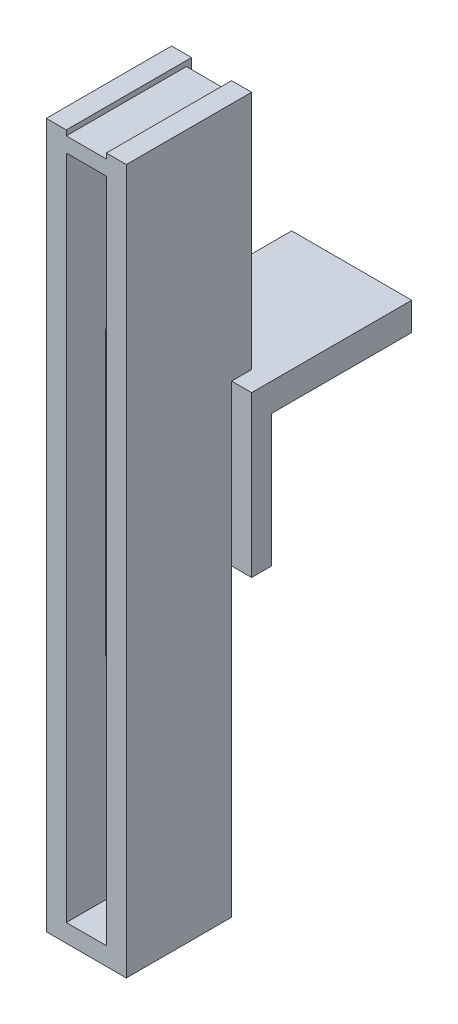
ISO-10303-21;
HEADER;
FILE_DESCRIPTION(('STEP AP214'),'2;1');
FILE_NAME('part.step','',(''),(''),'','','');
FILE_SCHEMA(('AUTOMOTIVE_DESIGN { 1 0 10303 214 1 1 1 1 }'));
ENDSEC;
DATA;
#1=APPLICATION_CONTEXT('core data for automotive mechanical design processes');
#2=APPLICATION_PROTOCOL_DEFINITION('international standard','automotive_design',2000,#1);
#3=PRODUCT_CONTEXT('',#1,'mechanical');
#4=PRODUCT('Part','Part','',(#3));
#5=PRODUCT_RELATED_PRODUCT_CATEGORY('part','',(#4));
#6=PRODUCT_DEFINITION_FORMATION('','',#4);
#7=PRODUCT_DEFINITION_CONTEXT('part definition',#1,'design');
#8=PRODUCT_DEFINITION('design','',#6,#7);
#9=PRODUCT_DEFINITION_SHAPE('','',#8);
#10=(LENGTH_UNIT() NAMED_UNIT(*) SI_UNIT(.MILLI.,.METRE.));
#11=(NAMED_UNIT(*) PLANE_ANGLE_UNIT() SI_UNIT($,.RADIAN.));
#12=(NAMED_UNIT(*) SI_UNIT($,.STERADIAN.) SOLID_ANGLE_UNIT());
#13=UNCERTAINTY_MEASURE_WITH_UNIT(LENGTH_MEASURE(1.E-05),#10,'distance_accuracy_value','');
#14=(GEOMETRIC_REPRESENTATION_CONTEXT(3) GLOBAL_UNCERTAINTY_ASSIGNED_CONTEXT((#13)) GLOBAL_UNIT_ASSIGNED_CONTEXT((#10,
#11,#12)) REPRESENTATION_CONTEXT('',''));
#15=CARTESIAN_POINT('',(0.,0.,0.));
#16=DIRECTION('',(0.,0.,1.));
#17=DIRECTION('',(1.,0.,0.));
#18=AXIS2_PLACEMENT_3D('',#15,#16,#17);
#19=CARTESIAN_POINT('',(-5.,0.,0.));
#20=DIRECTION('',(1.,0.,0.));
#21=DIRECTION('',(0.,0.,-1.));
#22=AXIS2_PLACEMENT_3D('',#19,#20,#21);
#23=PLANE('',#22);
#24=DIRECTION('',(0.,-1.,0.));
#25=VECTOR('',#24,1.);
#26=CARTESIAN_POINT('',(-5.,60.,26.3));
#27=LINE('',#26,#25);
#28=CARTESIAN_POINT('',(-5.,55.,26.3));
#29=VERTEX_POINT('',#28);
#30=CARTESIAN_POINT('',(-5.,-111.5,26.3));
#31=VERTEX_POINT('',#30);
#32=EDGE_CURVE('E262',#29,#31,#27,.T.);
#33=ORIENTED_EDGE('',*,*,#32,.T.);
#34=DIRECTION('',(0.,0.,-1.));
#35=VECTOR('',#34,1.);
#36=CARTESIAN_POINT('',(-5.,-111.5,26.3));
#37=LINE('',#36,#35);
#38=CARTESIAN_POINT('',(-5.,-111.5,8.50000000000001));
#39=VERTEX_POINT('',#38);
#40=EDGE_CURVE('E228',#31,#39,#37,.T.);
#41=ORIENTED_EDGE('',*,*,#40,.T.);
#42=DIRECTION('',(0.,-1.,0.));
#43=VECTOR('',#42,1.);
#44=CARTESIAN_POINT('',(-5.,-71.6268822125199,8.5));
#45=LINE('',#44,#43);
#46=CARTESIAN_POINT('',(-5.,-71.6268822125199,8.5));
#47=VERTEX_POINT('',#46);
#48=EDGE_CURVE('E313',#47,#39,#45,.T.);
#49=ORIENTED_EDGE('',*,*,#48,.F.);
#50=DIRECTION('',(0.,-0.850975633269342,-0.525205170939741));
#51=VECTOR('',#50,1.);
#52=CARTESIAN_POINT('',(-5.,-58.6123165611938,16.5323300813571));
#53=LINE('',#52,#51);
#54=CARTESIAN_POINT('',(-5.,-58.6123165611938,16.5323300813571));
#55=VERTEX_POINT('',#54);
#56=EDGE_CURVE('E325',#55,#47,#53,.T.);
#57=ORIENTED_EDGE('',*,*,#56,.F.);
#58=DIRECTION('',(0.,-1.,0.));
#59=VECTOR('',#58,1.);
#60=CARTESIAN_POINT('',(-5.,11.8291720369188,16.5323300813571));
#61=LINE('',#60,#59);
#62=CARTESIAN_POINT('',(-5.,11.8291720369188,16.5323300813571));
#63=VERTEX_POINT('',#62);
#64=EDGE_CURVE('E322',#63,#55,#61,.T.);
#65=ORIENTED_EDGE('',*,*,#64,.F.);
#66=DIRECTION('',(0.,-0.866025403784442,0.499999999999995));
#67=VECTOR('',#66,1.);
#68=CARTESIAN_POINT('',(-5.,40.464007705329,0.));
#69=LINE('',#68,#67);
#70=CARTESIAN_POINT('',(-5.,40.464007705329,0.));
#71=VERTEX_POINT('',#70);
#72=EDGE_CURVE('E301',#71,#63,#69,.T.);
#73=ORIENTED_EDGE('',*,*,#72,.F.);
#74=DIRECTION('',(0.,1.,0.));
#75=VECTOR('',#74,1.);
#76=CARTESIAN_POINT('',(-5.,0.,0.));
#77=LINE('',#76,#75);
#78=CARTESIAN_POINT('',(-5.,55.,0.));
#79=VERTEX_POINT('',#78);
#80=EDGE_CURVE('E448',#71,#79,#77,.T.);
#81=ORIENTED_EDGE('',*,*,#80,.T.);
#82=DIRECTION('',(0.,0.,1.));
#83=VECTOR('',#82,1.);
#84=CARTESIAN_POINT('',(-5.,55.,0.));
#85=LINE('',#84,#83);
#86=EDGE_CURVE('E459',#79,#29,#85,.T.);
#87=ORIENTED_EDGE('',*,*,#86,.T.);
#88=EDGE_LOOP('',(#33,#41,#49,#57,#65,#73,#81,#87));
#89=FACE_BOUND('',#88,.T.);
#90=ADVANCED_FACE('F43',(#89),#23,.T.);
#91=CARTESIAN_POINT('',(5.,0.,0.));
#92=DIRECTION('',(-1.,0.,0.));
#93=DIRECTION('',(0.,0.,-1.));
#94=AXIS2_PLACEMENT_3D('',#91,#92,#93);
#95=PLANE('',#94);
#96=DIRECTION('',(0.,-1.,0.));
#97=VECTOR('',#96,1.);
#98=CARTESIAN_POINT('',(5.,-71.6268822125199,8.5));
#99=LINE('',#98,#97);
#100=CARTESIAN_POINT('',(5.,-71.6268822125199,8.5));
#101=VERTEX_POINT('',#100);
#102=CARTESIAN_POINT('',(5.,-111.5,8.50000000000001));
#103=VERTEX_POINT('',#102);
#104=EDGE_CURVE('E240',#101,#103,#99,.T.);
#105=ORIENTED_EDGE('',*,*,#104,.T.);
#106=DIRECTION('',(0.,0.,-1.));
#107=VECTOR('',#106,1.);
#108=CARTESIAN_POINT('',(5.,-111.5,26.3));
#109=LINE('',#108,#107);
#110=CARTESIAN_POINT('',(5.,-111.5,26.3));
#111=VERTEX_POINT('',#110);
#112=EDGE_CURVE('E225',#111,#103,#109,.T.);
#113=ORIENTED_EDGE('',*,*,#112,.F.);
#114=DIRECTION('',(0.,-1.,0.));
#115=VECTOR('',#114,1.);
#116=CARTESIAN_POINT('',(5.,60.,26.3));
#117=LINE('',#116,#115);
#118=CARTESIAN_POINT('',(5.,55.,26.3));
#119=VERTEX_POINT('',#118);
#120=EDGE_CURVE('E237',#119,#111,#117,.T.);
#121=ORIENTED_EDGE('',*,*,#120,.F.);
#122=DIRECTION('',(0.,0.,1.));
#123=VECTOR('',#122,1.);
#124=CARTESIAN_POINT('',(5.,55.,0.));
#125=LINE('',#124,#123);
#126=CARTESIAN_POINT('',(5.,55.,0.));
#127=VERTEX_POINT('',#126);
#128=EDGE_CURVE('E451',#127,#119,#125,.T.);
#129=ORIENTED_EDGE('',*,*,#128,.F.);
#130=DIRECTION('',(0.,1.,0.));
#131=VECTOR('',#130,1.);
#132=CARTESIAN_POINT('',(5.,0.,0.));
#133=LINE('',#132,#131);
#134=CARTESIAN_POINT('',(5.,40.464007705329,0.));
#135=VERTEX_POINT('',#134);
#136=EDGE_CURVE('E241',#135,#127,#133,.T.);
#137=ORIENTED_EDGE('',*,*,#136,.F.);
#138=DIRECTION('',(0.,-0.866025403784442,0.499999999999995));
#139=VECTOR('',#138,1.);
#140=CARTESIAN_POINT('',(5.,40.464007705329,0.));
#141=LINE('',#140,#139);
#142=CARTESIAN_POINT('',(5.,11.8291720369188,16.5323300813571));
#143=VERTEX_POINT('',#142);
#144=EDGE_CURVE('E309',#135,#143,#141,.T.);
#145=ORIENTED_EDGE('',*,*,#144,.T.);
#146=DIRECTION('',(0.,-1.,0.));
#147=VECTOR('',#146,1.);
#148=CARTESIAN_POINT('',(5.,11.8291720369188,16.5323300813571));
#149=LINE('',#148,#147);
#150=CARTESIAN_POINT('',(5.,-58.6123165611938,16.5323300813571));
#151=VERTEX_POINT('',#150);
#152=EDGE_CURVE('E312',#143,#151,#149,.T.);
#153=ORIENTED_EDGE('',*,*,#152,.T.);
#154=DIRECTION('',(0.,-0.850975633269342,-0.525205170939741));
#155=VECTOR('',#154,1.);
#156=CARTESIAN_POINT('',(5.,-58.6123165611938,16.5323300813571));
#157=LINE('',#156,#155);
#158=EDGE_CURVE('E316',#151,#101,#157,.T.);
#159=ORIENTED_EDGE('',*,*,#158,.T.);
#160=EDGE_LOOP('',(#105,#113,#121,#129,#137,#145,#153,#159));
#161=FACE_BOUND('',#160,.T.);
#162=ADVANCED_FACE('F235',(#161),#95,.T.);
#163=CARTESIAN_POINT('',(5.,-71.6268822125199,8.5));
#164=DIRECTION('',(0.,0.,-1.));
#165=DIRECTION('',(0.,1.,0.));
#166=AXIS2_PLACEMENT_3D('',#163,#164,#165);
#167=PLANE('',#166);
#168=DIRECTION('',(-1.,0.,0.));
#169=VECTOR('',#168,1.);
#170=CARTESIAN_POINT('',(-5.,-111.5,8.50000000000001));
#171=LINE('',#170,#169);
#172=EDGE_CURVE('E230',#103,#39,#171,.T.);
#173=ORIENTED_EDGE('',*,*,#172,.F.);
#174=ORIENTED_EDGE('',*,*,#104,.F.);
#175=DIRECTION('',(-1.,0.,0.));
#176=VECTOR('',#175,1.);
#177=CARTESIAN_POINT('',(5.,-71.6268822125199,8.5));
#178=LINE('',#177,#176);
#179=EDGE_CURVE('E331',#101,#47,#178,.T.);
#180=ORIENTED_EDGE('',*,*,#179,.T.);
#181=ORIENTED_EDGE('',*,*,#48,.T.);
#182=EDGE_LOOP('',(#173,#174,#180,#181));
#183=FACE_BOUND('',#182,.T.);
#184=ADVANCED_FACE('F467',(#183),#167,.F.);
#185=CARTESIAN_POINT('',(15.,0.,-40.));
#186=DIRECTION('',(0.,-1.,0.));
#187=DIRECTION('',(0.,0.,-1.));
#188=AXIS2_PLACEMENT_3D('',#185,#186,#187);
#189=PLANE('',#188);
#190=DIRECTION('',(1.,0.,0.));
#191=VECTOR('',#190,1.);
#192=CARTESIAN_POINT('',(-5.,0.,-3.69999999999999));
#193=LINE('',#192,#191);
#194=CARTESIAN_POINT('',(-5.,0.,-3.69999999999999));
#195=VERTEX_POINT('',#194);
#196=CARTESIAN_POINT('',(5.,0.,-3.69999999999999));
#197=VERTEX_POINT('',#196);
#198=EDGE_CURVE('E442',#195,#197,#193,.T.);
#199=ORIENTED_EDGE('',*,*,#198,.T.);
#200=DIRECTION('',(0.,0.,-1.));
#201=VECTOR('',#200,1.);
#202=CARTESIAN_POINT('',(5.,0.,0.));
#203=LINE('',#202,#201);
#204=CARTESIAN_POINT('',(5.,0.,-5.));
#205=VERTEX_POINT('',#204);
#206=EDGE_CURVE('E258',#197,#205,#203,.T.);
#207=ORIENTED_EDGE('',*,*,#206,.T.);
#208=DIRECTION('',(-1.,0.,0.));
#209=VECTOR('',#208,1.);
#210=CARTESIAN_POINT('',(10.,0.,-5.));
#211=LINE('',#210,#209);
#212=CARTESIAN_POINT('',(10.,0.,-5.));
#213=VERTEX_POINT('',#212);
#214=EDGE_CURVE('E66',#213,#205,#211,.T.);
#215=ORIENTED_EDGE('',*,*,#214,.F.);
#216=DIRECTION('',(0.,0.,-1.));
#217=VECTOR('',#216,1.);
#218=CARTESIAN_POINT('',(10.,0.,0.));
#219=LINE('',#218,#217);
#220=CARTESIAN_POINT('',(10.,0.,0.));
#221=VERTEX_POINT('',#220);
#222=EDGE_CURVE('E426',#221,#213,#219,.T.);
#223=ORIENTED_EDGE('',*,*,#222,.F.);
#224=DIRECTION('',(-1.,0.,0.));
#225=VECTOR('',#224,1.);
#226=CARTESIAN_POINT('',(15.,0.,0.));
#227=LINE('',#226,#225);
#228=CARTESIAN_POINT('',(15.,0.,0.));
#229=VERTEX_POINT('',#228);
#230=EDGE_CURVE('E11',#229,#221,#227,.T.);
#231=ORIENTED_EDGE('',*,*,#230,.F.);
#232=DIRECTION('',(0.,0.,1.));
#233=VECTOR('',#232,1.);
#234=CARTESIAN_POINT('',(15.,0.,-40.));
#235=LINE('',#234,#233);
#236=CARTESIAN_POINT('',(15.,0.,-40.));
#237=VERTEX_POINT('',#236);
#238=EDGE_CURVE('E344',#237,#229,#235,.T.);
#239=ORIENTED_EDGE('',*,*,#238,.F.);
#240=DIRECTION('',(-1.,0.,0.));
#241=VECTOR('',#240,1.);
#242=CARTESIAN_POINT('',(15.,0.,-40.));
#243=LINE('',#242,#241);
#244=CARTESIAN_POINT('',(-15.,0.,-40.));
#245=VERTEX_POINT('',#244);
#246=EDGE_CURVE('E358',#237,#245,#243,.T.);
#247=ORIENTED_EDGE('',*,*,#246,.T.);
#248=DIRECTION('',(0.,0.,1.));
#249=VECTOR('',#248,1.);
#250=CARTESIAN_POINT('',(-15.,0.,-40.));
#251=LINE('',#250,#249);
#252=CARTESIAN_POINT('',(-15.,0.,0.));
#253=VERTEX_POINT('',#252);
#254=EDGE_CURVE('E343',#245,#253,#251,.T.);
#255=ORIENTED_EDGE('',*,*,#254,.T.);
#256=CARTESIAN_POINT('',(-10.,0.,0.));
#257=VERTEX_POINT('',#256);
#258=EDGE_CURVE('E51',#257,#253,#227,.T.);
#259=ORIENTED_EDGE('',*,*,#258,.F.);
#260=DIRECTION('',(0.,0.,-1.));
#261=VECTOR('',#260,1.);
#262=CARTESIAN_POINT('',(-10.,0.,0.));
#263=LINE('',#262,#261);
#264=CARTESIAN_POINT('',(-10.,0.,-5.));
#265=VERTEX_POINT('',#264);
#266=EDGE_CURVE('E280',#257,#265,#263,.T.);
#267=ORIENTED_EDGE('',*,*,#266,.T.);
#268=DIRECTION('',(1.,0.,0.));
#269=VECTOR('',#268,1.);
#270=CARTESIAN_POINT('',(-10.,0.,-5.));
#271=LINE('',#270,#269);
#272=CARTESIAN_POINT('',(-5.,0.,-5.));
#273=VERTEX_POINT('',#272);
#274=EDGE_CURVE('E305',#265,#273,#271,.T.);
#275=ORIENTED_EDGE('',*,*,#274,.T.);
#276=DIRECTION('',(0.,0.,-1.));
#277=VECTOR('',#276,1.);
#278=CARTESIAN_POINT('',(-5.,0.,0.));
#279=LINE('',#278,#277);
#280=EDGE_CURVE('E292',#195,#273,#279,.T.);
#281=ORIENTED_EDGE('',*,*,#280,.F.);
#282=EDGE_LOOP('',(#199,#207,#215,#223,#231,#239,#247,#255,#259,#267,#275,#281));
#283=FACE_BOUND('',#282,.T.);
#284=ADVANCED_FACE('F45',(#283),#189,.F.);
#285=CARTESIAN_POINT('',(-5.,60.,26.3));
#286=VERTEX_POINT('',#285);
#287=CARTESIAN_POINT('',(-5.,58.7,26.3));
#288=VERTEX_POINT('',#287);
#289=EDGE_CURVE('E289',#286,#288,#27,.T.);
#290=ORIENTED_EDGE('',*,*,#289,.T.);
#291=DIRECTION('',(0.,0.,-1.));
#292=VECTOR('',#291,1.);
#293=CARTESIAN_POINT('',(-5.,58.7,26.3));
#294=LINE('',#293,#292);
#295=CARTESIAN_POINT('',(-5.,58.7,-3.7));
#296=VERTEX_POINT('',#295);
#297=EDGE_CURVE('E456',#288,#296,#294,.T.);
#298=ORIENTED_EDGE('',*,*,#297,.T.);
#299=DIRECTION('',(0.,-1.,0.));
#300=VECTOR('',#299,1.);
#301=CARTESIAN_POINT('',(-5.,58.7,-3.7));
#302=LINE('',#301,#300);
#303=EDGE_CURVE('E445',#296,#195,#302,.T.);
#304=ORIENTED_EDGE('',*,*,#303,.T.);
#305=ORIENTED_EDGE('',*,*,#280,.T.);
#306=DIRECTION('',(0.,1.,0.));
#307=VECTOR('',#306,1.);
#308=CARTESIAN_POINT('',(-5.,0.,-5.));
#309=LINE('',#308,#307);
#310=CARTESIAN_POINT('',(-5.,60.,-5.));
#311=VERTEX_POINT('',#310);
#312=EDGE_CURVE('E294',#273,#311,#309,.T.);
#313=ORIENTED_EDGE('',*,*,#312,.T.);
#314=DIRECTION('',(0.,0.,1.));
#315=VECTOR('',#314,1.);
#316=CARTESIAN_POINT('',(-5.,60.,0.));
#317=LINE('',#316,#315);
#318=EDGE_CURVE('E273',#311,#286,#317,.T.);
#319=ORIENTED_EDGE('',*,*,#318,.T.);
#320=EDGE_LOOP('',(#290,#298,#304,#305,#313,#319));
#321=FACE_BOUND('',#320,.T.);
#322=ADVANCED_FACE('F498',(#321),#23,.T.);
#323=DIRECTION('',(0.,-1.,0.));
#324=VECTOR('',#323,1.);
#325=CARTESIAN_POINT('',(5.,58.7,-3.7));
#326=LINE('',#325,#324);
#327=CARTESIAN_POINT('',(5.,58.7,-3.7));
#328=VERTEX_POINT('',#327);
#329=EDGE_CURVE('E446',#328,#197,#326,.T.);
#330=ORIENTED_EDGE('',*,*,#329,.F.);
#331=DIRECTION('',(0.,0.,-1.));
#332=VECTOR('',#331,1.);
#333=CARTESIAN_POINT('',(5.,58.7,26.3));
#334=LINE('',#333,#332);
#335=CARTESIAN_POINT('',(5.,58.7,26.3));
#336=VERTEX_POINT('',#335);
#337=EDGE_CURVE('E449',#336,#328,#334,.T.);
#338=ORIENTED_EDGE('',*,*,#337,.F.);
#339=CARTESIAN_POINT('',(5.,60.,26.3));
#340=VERTEX_POINT('',#339);
#341=EDGE_CURVE('E244',#340,#336,#117,.T.);
#342=ORIENTED_EDGE('',*,*,#341,.F.);
#343=DIRECTION('',(0.,0.,1.));
#344=VECTOR('',#343,1.);
#345=CARTESIAN_POINT('',(5.,60.,-5.));
#346=LINE('',#345,#344);
#347=CARTESIAN_POINT('',(5.,60.,-5.));
#348=VERTEX_POINT('',#347);
#349=EDGE_CURVE('E248',#348,#340,#346,.T.);
#350=ORIENTED_EDGE('',*,*,#349,.F.);
#351=DIRECTION('',(0.,1.,0.));
#352=VECTOR('',#351,1.);
#353=CARTESIAN_POINT('',(5.,0.,-5.));
#354=LINE('',#353,#352);
#355=EDGE_CURVE('E256',#205,#348,#354,.T.);
#356=ORIENTED_EDGE('',*,*,#355,.F.);
#357=ORIENTED_EDGE('',*,*,#206,.F.);
#358=EDGE_LOOP('',(#330,#338,#342,#350,#356,#357));
#359=FACE_BOUND('',#358,.T.);
#360=ADVANCED_FACE('F504',(#359),#95,.T.);
#361=CARTESIAN_POINT('',(15.,0.,0.));
#362=DIRECTION('',(0.,0.,-1.));
#363=DIRECTION('',(-1.,0.,0.));
#364=AXIS2_PLACEMENT_3D('',#361,#362,#363);
#365=PLANE('',#364);
#366=DIRECTION('',(0.,1.,0.));
#367=VECTOR('',#366,1.);
#368=CARTESIAN_POINT('',(10.,-116.,0.));
#369=LINE('',#368,#367);
#370=CARTESIAN_POINT('',(10.,-40.,0.));
#371=VERTEX_POINT('',#370);
#372=EDGE_CURVE('E423',#371,#221,#369,.T.);
#373=ORIENTED_EDGE('',*,*,#372,.F.);
#374=DIRECTION('',(-1.,0.,0.));
#375=VECTOR('',#374,1.);
#376=CARTESIAN_POINT('',(15.,-40.,0.));
#377=LINE('',#376,#375);
#378=CARTESIAN_POINT('',(15.,-40.,0.));
#379=VERTEX_POINT('',#378);
#380=EDGE_CURVE('E382',#379,#371,#377,.T.);
#381=ORIENTED_EDGE('',*,*,#380,.F.);
#382=DIRECTION('',(0.,-1.,0.));
#383=VECTOR('',#382,1.);
#384=CARTESIAN_POINT('',(15.,0.,0.));
#385=LINE('',#384,#383);
#386=EDGE_CURVE('E347',#229,#379,#385,.T.);
#387=ORIENTED_EDGE('',*,*,#386,.F.);
#388=ORIENTED_EDGE('',*,*,#230,.T.);
#389=EDGE_LOOP('',(#373,#381,#387,#388));
#390=FACE_BOUND('',#389,.T.);
#391=ADVANCED_FACE('F421',(#390),#365,.F.);
#392=DIRECTION('',(0.,1.,0.));
#393=VECTOR('',#392,1.);
#394=CARTESIAN_POINT('',(-10.,-116.,0.));
#395=LINE('',#394,#393);
#396=CARTESIAN_POINT('',(-10.,-40.,0.));
#397=VERTEX_POINT('',#396);
#398=EDGE_CURVE('E276',#397,#257,#395,.T.);
#399=ORIENTED_EDGE('',*,*,#398,.T.);
#400=ORIENTED_EDGE('',*,*,#258,.T.);
#401=DIRECTION('',(0.,-1.,0.));
#402=VECTOR('',#401,1.);
#403=CARTESIAN_POINT('',(-15.,0.,0.));
#404=LINE('',#403,#402);
#405=CARTESIAN_POINT('',(-15.,-40.,0.));
#406=VERTEX_POINT('',#405);
#407=EDGE_CURVE('E361',#253,#406,#404,.T.);
#408=ORIENTED_EDGE('',*,*,#407,.T.);
#409=EDGE_CURVE('E381',#397,#406,#377,.T.);
#410=ORIENTED_EDGE('',*,*,#409,.F.);
#411=EDGE_LOOP('',(#399,#400,#408,#410));
#412=FACE_BOUND('',#411,.T.);
#413=ADVANCED_FACE('F397',(#412),#365,.F.);
#414=CARTESIAN_POINT('',(15.,-40.,0.));
#415=DIRECTION('',(0.,1.,0.));
#416=DIRECTION('',(0.,0.,1.));
#417=AXIS2_PLACEMENT_3D('',#414,#415,#416);
#418=PLANE('',#417);
#419=DIRECTION('',(0.,0.,-1.));
#420=VECTOR('',#419,1.);
#421=CARTESIAN_POINT('',(-15.,-40.,0.));
#422=LINE('',#421,#420);
#423=CARTESIAN_POINT('',(-15.,-40.,-5.00000000000001));
#424=VERTEX_POINT('',#423);
#425=EDGE_CURVE('E364',#406,#424,#422,.T.);
#426=ORIENTED_EDGE('',*,*,#425,.T.);
#427=DIRECTION('',(-1.,0.,0.));
#428=VECTOR('',#427,1.);
#429=CARTESIAN_POINT('',(15.,-40.,-5.00000000000001));
#430=LINE('',#429,#428);
#431=CARTESIAN_POINT('',(15.,-40.,-5.00000000000001));
#432=VERTEX_POINT('',#431);
#433=EDGE_CURVE('E379',#432,#424,#430,.T.);
#434=ORIENTED_EDGE('',*,*,#433,.F.);
#435=DIRECTION('',(0.,0.,-1.));
#436=VECTOR('',#435,1.);
#437=CARTESIAN_POINT('',(15.,-40.,0.));
#438=LINE('',#437,#436);
#439=EDGE_CURVE('E350',#379,#432,#438,.T.);
#440=ORIENTED_EDGE('',*,*,#439,.F.);
#441=ORIENTED_EDGE('',*,*,#380,.T.);
#442=EDGE_CURVE('E384',#371,#397,#377,.T.);
#443=ORIENTED_EDGE('',*,*,#442,.T.);
#444=ORIENTED_EDGE('',*,*,#409,.T.);
#445=EDGE_LOOP('',(#426,#434,#440,#441,#443,#444));
#446=FACE_BOUND('',#445,.T.);
#447=ADVANCED_FACE('F390',(#446),#418,.F.);
#448=CARTESIAN_POINT('',(15.,-40.,-5.00000000000001));
#449=DIRECTION('',(0.,0.,1.));
#450=DIRECTION('',(1.,0.,0.));
#451=AXIS2_PLACEMENT_3D('',#448,#449,#450);
#452=PLANE('',#451);
#453=DIRECTION('',(0.,1.,0.));
#454=VECTOR('',#453,1.);
#455=CARTESIAN_POINT('',(-15.,-40.,-5.00000000000001));
#456=LINE('',#455,#454);
#457=CARTESIAN_POINT('',(-15.,-7.00000000000001,-5.00000000000001));
#458=VERTEX_POINT('',#457);
#459=EDGE_CURVE('E366',#424,#458,#456,.T.);
#460=ORIENTED_EDGE('',*,*,#459,.T.);
#461=DIRECTION('',(-1.,0.,0.));
#462=VECTOR('',#461,1.);
#463=CARTESIAN_POINT('',(15.,-7.00000000000001,-5.00000000000001));
#464=LINE('',#463,#462);
#465=CARTESIAN_POINT('',(15.,-7.00000000000001,-5.00000000000001));
#466=VERTEX_POINT('',#465);
#467=EDGE_CURVE('E376',#466,#458,#464,.T.);
#468=ORIENTED_EDGE('',*,*,#467,.F.);
#469=DIRECTION('',(0.,1.,0.));
#470=VECTOR('',#469,1.);
#471=CARTESIAN_POINT('',(15.,-40.,-5.00000000000001));
#472=LINE('',#471,#470);
#473=EDGE_CURVE('E352',#432,#466,#472,.T.);
#474=ORIENTED_EDGE('',*,*,#473,.F.);
#475=ORIENTED_EDGE('',*,*,#433,.T.);
#476=EDGE_LOOP('',(#460,#468,#474,#475));
#477=FACE_BOUND('',#476,.T.);
#478=ADVANCED_FACE('F407',(#477),#452,.F.);
#479=CARTESIAN_POINT('',(15.,-7.00000000000001,-5.00000000000001));
#480=DIRECTION('',(0.,1.,0.));
#481=DIRECTION('',(0.,0.,1.));
#482=AXIS2_PLACEMENT_3D('',#479,#480,#481);
#483=PLANE('',#482);
#484=DIRECTION('',(0.,0.,-1.));
#485=VECTOR('',#484,1.);
#486=CARTESIAN_POINT('',(-15.,-7.00000000000001,-5.00000000000001));
#487=LINE('',#486,#485);
#488=CARTESIAN_POINT('',(-15.,-7.00000000000001,-40.));
#489=VERTEX_POINT('',#488);
#490=EDGE_CURVE('E368',#458,#489,#487,.T.);
#491=ORIENTED_EDGE('',*,*,#490,.T.);
#492=DIRECTION('',(-1.,0.,0.));
#493=VECTOR('',#492,1.);
#494=CARTESIAN_POINT('',(15.,-7.00000000000001,-40.));
#495=LINE('',#494,#493);
#496=CARTESIAN_POINT('',(15.,-7.00000000000001,-40.));
#497=VERTEX_POINT('',#496);
#498=EDGE_CURVE('E373',#497,#489,#495,.T.);
#499=ORIENTED_EDGE('',*,*,#498,.F.);
#500=DIRECTION('',(0.,0.,-1.));
#501=VECTOR('',#500,1.);
#502=CARTESIAN_POINT('',(15.,-7.00000000000001,-5.00000000000001));
#503=LINE('',#502,#501);
#504=EDGE_CURVE('E354',#466,#497,#503,.T.);
#505=ORIENTED_EDGE('',*,*,#504,.F.);
#506=ORIENTED_EDGE('',*,*,#467,.T.);
#507=EDGE_LOOP('',(#491,#499,#505,#506));
#508=FACE_BOUND('',#507,.T.);
#509=ADVANCED_FACE('F411',(#508),#483,.F.);
#510=CARTESIAN_POINT('',(15.,-7.00000000000001,-40.));
#511=DIRECTION('',(0.,0.,1.));
#512=DIRECTION('',(1.,0.,0.));
#513=AXIS2_PLACEMENT_3D('',#510,#511,#512);
#514=PLANE('',#513);
#515=DIRECTION('',(0.,1.,0.));
#516=VECTOR('',#515,1.);
#517=CARTESIAN_POINT('',(-15.,-7.00000000000001,-40.));
#518=LINE('',#517,#516);
#519=EDGE_CURVE('E348',#489,#245,#518,.T.);
#520=ORIENTED_EDGE('',*,*,#519,.T.);
#521=ORIENTED_EDGE('',*,*,#246,.F.);
#522=DIRECTION('',(0.,1.,0.));
#523=VECTOR('',#522,1.);
#524=CARTESIAN_POINT('',(15.,-7.00000000000001,-40.));
#525=LINE('',#524,#523);
#526=EDGE_CURVE('E356',#497,#237,#525,.T.);
#527=ORIENTED_EDGE('',*,*,#526,.F.);
#528=ORIENTED_EDGE('',*,*,#498,.T.);
#529=EDGE_LOOP('',(#520,#521,#527,#528));
#530=FACE_BOUND('',#529,.T.);
#531=ADVANCED_FACE('F563',(#530),#514,.F.);
#532=CARTESIAN_POINT('',(15.,0.,0.));
#533=DIRECTION('',(1.,0.,0.));
#534=DIRECTION('',(0.,0.,-1.));
#535=AXIS2_PLACEMENT_3D('',#532,#533,#534);
#536=PLANE('',#535);
#537=ORIENTED_EDGE('',*,*,#238,.T.);
#538=ORIENTED_EDGE('',*,*,#386,.T.);
#539=ORIENTED_EDGE('',*,*,#439,.T.);
#540=ORIENTED_EDGE('',*,*,#473,.T.);
#541=ORIENTED_EDGE('',*,*,#504,.T.);
#542=ORIENTED_EDGE('',*,*,#526,.T.);
#543=EDGE_LOOP('',(#537,#538,#539,#540,#541,#542));
#544=FACE_BOUND('',#543,.T.);
#545=ADVANCED_FACE('F415',(#544),#536,.T.);
#546=CARTESIAN_POINT('',(-15.,0.,0.));
#547=DIRECTION('',(1.,0.,0.));
#548=DIRECTION('',(0.,0.,-1.));
#549=AXIS2_PLACEMENT_3D('',#546,#547,#548);
#550=PLANE('',#549);
#551=ORIENTED_EDGE('',*,*,#254,.F.);
#552=ORIENTED_EDGE('',*,*,#519,.F.);
#553=ORIENTED_EDGE('',*,*,#490,.F.);
#554=ORIENTED_EDGE('',*,*,#459,.F.);
#555=ORIENTED_EDGE('',*,*,#425,.F.);
#556=ORIENTED_EDGE('',*,*,#407,.F.);
#557=EDGE_LOOP('',(#551,#552,#553,#554,#555,#556));
#558=FACE_BOUND('',#557,.T.);
#559=ADVANCED_FACE('F402',(#558),#550,.F.);
#560=CARTESIAN_POINT('',(5.,-116.,0.));
#561=DIRECTION('',(0.,0.,1.));
#562=DIRECTION('',(1.,0.,0.));
#563=AXIS2_PLACEMENT_3D('',#560,#561,#562);
#564=PLANE('',#563);
#565=ORIENTED_EDGE('',*,*,#442,.F.);
#566=CARTESIAN_POINT('',(10.,-116.,0.));
#567=VERTEX_POINT('',#566);
#568=EDGE_CURVE('E425',#567,#371,#369,.T.);
#569=ORIENTED_EDGE('',*,*,#568,.F.);
#570=DIRECTION('',(-1.,0.,0.));
#571=VECTOR('',#570,1.);
#572=CARTESIAN_POINT('',(5.,-116.,0.));
#573=LINE('',#572,#571);
#574=CARTESIAN_POINT('',(-10.,-116.,0.));
#575=VERTEX_POINT('',#574);
#576=EDGE_CURVE('E319',#567,#575,#573,.T.);
#577=ORIENTED_EDGE('',*,*,#576,.T.);
#578=EDGE_CURVE('E277',#575,#397,#395,.T.);
#579=ORIENTED_EDGE('',*,*,#578,.T.);
#580=EDGE_LOOP('',(#565,#569,#577,#579));
#581=FACE_BOUND('',#580,.T.);
#582=ADVANCED_FACE('F557',(#581),#564,.F.);
#583=CARTESIAN_POINT('',(5.,40.464007705329,0.));
#584=DIRECTION('',(0.,-0.499999999999995,-0.866025403784442));
#585=DIRECTION('',(0.,0.866025403784442,-0.499999999999995));
#586=AXIS2_PLACEMENT_3D('',#583,#584,#585);
#587=PLANE('',#586);
#588=ORIENTED_EDGE('',*,*,#72,.T.);
#589=DIRECTION('',(-1.,0.,0.));
#590=VECTOR('',#589,1.);
#591=CARTESIAN_POINT('',(5.,11.8291720369188,16.5323300813571));
#592=LINE('',#591,#590);
#593=EDGE_CURVE('E337',#143,#63,#592,.T.);
#594=ORIENTED_EDGE('',*,*,#593,.F.);
#595=ORIENTED_EDGE('',*,*,#144,.F.);
#596=DIRECTION('',(-1.,0.,0.));
#597=VECTOR('',#596,1.);
#598=CARTESIAN_POINT('',(5.,40.464007705329,0.));
#599=LINE('',#598,#597);
#600=EDGE_CURVE('E340',#135,#71,#599,.T.);
#601=ORIENTED_EDGE('',*,*,#600,.T.);
#602=EDGE_LOOP('',(#588,#594,#595,#601));
#603=FACE_BOUND('',#602,.T.);
#604=ADVANCED_FACE('F477',(#603),#587,.F.);
#605=CARTESIAN_POINT('',(5.,11.8291720369188,16.5323300813571));
#606=DIRECTION('',(0.,0.,-1.));
#607=DIRECTION('',(0.,1.,0.));
#608=AXIS2_PLACEMENT_3D('',#605,#606,#607);
#609=PLANE('',#608);
#610=ORIENTED_EDGE('',*,*,#64,.T.);
#611=DIRECTION('',(-1.,0.,0.));
#612=VECTOR('',#611,1.);
#613=CARTESIAN_POINT('',(5.,-58.6123165611938,16.5323300813571));
#614=LINE('',#613,#612);
#615=EDGE_CURVE('E334',#151,#55,#614,.T.);
#616=ORIENTED_EDGE('',*,*,#615,.F.);
#617=ORIENTED_EDGE('',*,*,#152,.F.);
#618=ORIENTED_EDGE('',*,*,#593,.T.);
#619=EDGE_LOOP('',(#610,#616,#617,#618));
#620=FACE_BOUND('',#619,.T.);
#621=ADVANCED_FACE('F473',(#620),#609,.F.);
#622=CARTESIAN_POINT('',(5.,-58.6123165611938,16.5323300813571));
#623=DIRECTION('',(0.,0.525205170939741,-0.850975633269342));
#624=DIRECTION('',(0.,0.850975633269342,0.525205170939741));
#625=AXIS2_PLACEMENT_3D('',#622,#623,#624);
#626=PLANE('',#625);
#627=ORIENTED_EDGE('',*,*,#56,.T.);
#628=ORIENTED_EDGE('',*,*,#179,.F.);
#629=ORIENTED_EDGE('',*,*,#158,.F.);
#630=ORIENTED_EDGE('',*,*,#615,.T.);
#631=EDGE_LOOP('',(#627,#628,#629,#630));
#632=FACE_BOUND('',#631,.T.);
#633=ADVANCED_FACE('F470',(#632),#626,.F.);
#634=CARTESIAN_POINT('',(5.,-116.,0.));
#635=DIRECTION('',(0.,1.,0.));
#636=DIRECTION('',(0.,0.,1.));
#637=AXIS2_PLACEMENT_3D('',#634,#635,#636);
#638=PLANE('',#637);
#639=DIRECTION('',(0.,0.,-1.));
#640=VECTOR('',#639,1.);
#641=CARTESIAN_POINT('',(10.,-116.,26.3));
#642=LINE('',#641,#640);
#643=CARTESIAN_POINT('',(10.,-116.,26.3));
#644=VERTEX_POINT('',#643);
#645=EDGE_CURVE('E253',#644,#567,#642,.T.);
#646=ORIENTED_EDGE('',*,*,#645,.F.);
#647=DIRECTION('',(1.,0.,0.));
#648=VECTOR('',#647,1.);
#649=CARTESIAN_POINT('',(-10.,-116.,26.3));
#650=LINE('',#649,#648);
#651=CARTESIAN_POINT('',(-10.,-116.,26.3));
#652=VERTEX_POINT('',#651);
#653=EDGE_CURVE('E288',#652,#644,#650,.T.);
#654=ORIENTED_EDGE('',*,*,#653,.F.);
#655=DIRECTION('',(0.,0.,-1.));
#656=VECTOR('',#655,1.);
#657=CARTESIAN_POINT('',(-10.,-116.,26.3));
#658=LINE('',#657,#656);
#659=EDGE_CURVE('E272',#652,#575,#658,.T.);
#660=ORIENTED_EDGE('',*,*,#659,.T.);
#661=ORIENTED_EDGE('',*,*,#576,.F.);
#662=EDGE_LOOP('',(#646,#654,#660,#661));
#663=FACE_BOUND('',#662,.T.);
#664=ADVANCED_FACE('F543',(#663),#638,.F.);
#665=CARTESIAN_POINT('',(-10.,60.,26.3));
#666=DIRECTION('',(0.,0.,1.));
#667=DIRECTION('',(0.,-1.,0.));
#668=AXIS2_PLACEMENT_3D('',#665,#666,#667);
#669=PLANE('',#668);
#670=ORIENTED_EDGE('',*,*,#653,.T.);
#671=DIRECTION('',(0.,-1.,0.));
#672=VECTOR('',#671,1.);
#673=CARTESIAN_POINT('',(10.,60.,26.3));
#674=LINE('',#673,#672);
#675=CARTESIAN_POINT('',(10.,60.,26.3));
#676=VERTEX_POINT('',#675);
#677=EDGE_CURVE('E260',#676,#644,#674,.T.);
#678=ORIENTED_EDGE('',*,*,#677,.F.);
#679=DIRECTION('',(-1.,0.,0.));
#680=VECTOR('',#679,1.);
#681=CARTESIAN_POINT('',(10.,60.,26.3));
#682=LINE('',#681,#680);
#683=EDGE_CURVE('E266',#676,#340,#682,.T.);
#684=ORIENTED_EDGE('',*,*,#683,.T.);
#685=ORIENTED_EDGE('',*,*,#341,.T.);
#686=DIRECTION('',(1.,0.,0.));
#687=VECTOR('',#686,1.);
#688=CARTESIAN_POINT('',(-5.,58.7,26.3));
#689=LINE('',#688,#687);
#690=EDGE_CURVE('E437',#288,#336,#689,.T.);
#691=ORIENTED_EDGE('',*,*,#690,.F.);
#692=ORIENTED_EDGE('',*,*,#289,.F.);
#693=DIRECTION('',(1.,0.,0.));
#694=VECTOR('',#693,1.);
#695=CARTESIAN_POINT('',(-10.,60.,26.3));
#696=LINE('',#695,#694);
#697=CARTESIAN_POINT('',(-10.,60.,26.3));
#698=VERTEX_POINT('',#697);
#699=EDGE_CURVE('E299',#698,#286,#696,.T.);
#700=ORIENTED_EDGE('',*,*,#699,.F.);
#701=DIRECTION('',(0.,-1.,0.));
#702=VECTOR('',#701,1.);
#703=CARTESIAN_POINT('',(-10.,60.,26.3));
#704=LINE('',#703,#702);
#705=EDGE_CURVE('E269',#698,#652,#704,.T.);
#706=ORIENTED_EDGE('',*,*,#705,.T.);
#707=EDGE_LOOP('',(#670,#678,#684,#685,#691,#692,#700,#706));
#708=FACE_BOUND('',#707,.T.);
#709=DIRECTION('',(-1.,0.,0.));
#710=VECTOR('',#709,1.);
#711=CARTESIAN_POINT('',(-5.,-111.5,26.3));
#712=LINE('',#711,#710);
#713=EDGE_CURVE('E222',#111,#31,#712,.T.);
#714=ORIENTED_EDGE('',*,*,#713,.T.);
#715=ORIENTED_EDGE('',*,*,#32,.F.);
#716=DIRECTION('',(1.,0.,0.));
#717=VECTOR('',#716,1.);
#718=CARTESIAN_POINT('',(-5.,55.,26.3));
#719=LINE('',#718,#717);
#720=EDGE_CURVE('E58',#29,#119,#719,.T.);
#721=ORIENTED_EDGE('',*,*,#720,.T.);
#722=ORIENTED_EDGE('',*,*,#120,.T.);
#723=EDGE_LOOP('',(#714,#715,#721,#722));
#724=FACE_BOUND('',#723,.T.);
#725=ADVANCED_FACE('F243',(#708,#724),#669,.T.);
#726=CARTESIAN_POINT('',(-10.,60.,0.));
#727=DIRECTION('',(0.,1.,0.));
#728=DIRECTION('',(0.,0.,1.));
#729=AXIS2_PLACEMENT_3D('',#726,#727,#728);
#730=PLANE('',#729);
#731=ORIENTED_EDGE('',*,*,#318,.F.);
#732=DIRECTION('',(1.,0.,0.));
#733=VECTOR('',#732,1.);
#734=CARTESIAN_POINT('',(-10.,60.,-5.));
#735=LINE('',#734,#733);
#736=CARTESIAN_POINT('',(-10.,60.,-5.));
#737=VERTEX_POINT('',#736);
#738=EDGE_CURVE('E302',#737,#311,#735,.T.);
#739=ORIENTED_EDGE('',*,*,#738,.F.);
#740=DIRECTION('',(0.,0.,1.));
#741=VECTOR('',#740,1.);
#742=CARTESIAN_POINT('',(-10.,60.,-5.));
#743=LINE('',#742,#741);
#744=EDGE_CURVE('E286',#737,#698,#743,.T.);
#745=ORIENTED_EDGE('',*,*,#744,.T.);
#746=ORIENTED_EDGE('',*,*,#699,.T.);
#747=EDGE_LOOP('',(#731,#739,#745,#746));
#748=FACE_BOUND('',#747,.T.);
#749=ADVANCED_FACE('F535',(#748),#730,.T.);
#750=CARTESIAN_POINT('',(-10.,0.,-5.));
#751=DIRECTION('',(0.,0.,-1.));
#752=DIRECTION('',(-1.,0.,0.));
#753=AXIS2_PLACEMENT_3D('',#750,#751,#752);
#754=PLANE('',#753);
#755=ORIENTED_EDGE('',*,*,#312,.F.);
#756=ORIENTED_EDGE('',*,*,#274,.F.);
#757=DIRECTION('',(0.,1.,0.));
#758=VECTOR('',#757,1.);
#759=CARTESIAN_POINT('',(-10.,0.,-5.));
#760=LINE('',#759,#758);
#761=EDGE_CURVE('E283',#265,#737,#760,.T.);
#762=ORIENTED_EDGE('',*,*,#761,.T.);
#763=ORIENTED_EDGE('',*,*,#738,.T.);
#764=EDGE_LOOP('',(#755,#756,#762,#763));
#765=FACE_BOUND('',#764,.T.);
#766=ADVANCED_FACE('F529',(#765),#754,.T.);
#767=CARTESIAN_POINT('',(-10.,0.,0.));
#768=DIRECTION('',(1.,0.,0.));
#769=DIRECTION('',(0.,0.,-1.));
#770=AXIS2_PLACEMENT_3D('',#767,#768,#769);
#771=PLANE('',#770);
#772=ORIENTED_EDGE('',*,*,#705,.F.);
#773=ORIENTED_EDGE('',*,*,#744,.F.);
#774=ORIENTED_EDGE('',*,*,#761,.F.);
#775=ORIENTED_EDGE('',*,*,#266,.F.);
#776=ORIENTED_EDGE('',*,*,#398,.F.);
#777=ORIENTED_EDGE('',*,*,#578,.F.);
#778=ORIENTED_EDGE('',*,*,#659,.F.);
#779=EDGE_LOOP('',(#772,#773,#774,#775,#776,#777,#778));
#780=FACE_BOUND('',#779,.T.);
#781=ADVANCED_FACE('F532',(#780),#771,.F.);
#782=CARTESIAN_POINT('',(10.,0.,-5.));
#783=DIRECTION('',(0.,0.,1.));
#784=DIRECTION('',(1.,0.,0.));
#785=AXIS2_PLACEMENT_3D('',#782,#783,#784);
#786=PLANE('',#785);
#787=ORIENTED_EDGE('',*,*,#355,.T.);
#788=DIRECTION('',(-1.,0.,0.));
#789=VECTOR('',#788,1.);
#790=CARTESIAN_POINT('',(10.,60.,-5.));
#791=LINE('',#790,#789);
#792=CARTESIAN_POINT('',(10.,60.,-5.));
#793=VERTEX_POINT('',#792);
#794=EDGE_CURVE('E263',#793,#348,#791,.T.);
#795=ORIENTED_EDGE('',*,*,#794,.F.);
#796=DIRECTION('',(0.,1.,0.));
#797=VECTOR('',#796,1.);
#798=CARTESIAN_POINT('',(10.,0.,-5.));
#799=LINE('',#798,#797);
#800=EDGE_CURVE('E427',#213,#793,#799,.T.);
#801=ORIENTED_EDGE('',*,*,#800,.F.);
#802=ORIENTED_EDGE('',*,*,#214,.T.);
#803=EDGE_LOOP('',(#787,#795,#801,#802));
#804=FACE_BOUND('',#803,.T.);
#805=ADVANCED_FACE('F610',(#804),#786,.F.);
#806=CARTESIAN_POINT('',(10.,60.,-5.));
#807=DIRECTION('',(0.,-1.,0.));
#808=DIRECTION('',(0.,0.,-1.));
#809=AXIS2_PLACEMENT_3D('',#806,#807,#808);
#810=PLANE('',#809);
#811=ORIENTED_EDGE('',*,*,#349,.T.);
#812=ORIENTED_EDGE('',*,*,#683,.F.);
#813=DIRECTION('',(0.,0.,1.));
#814=VECTOR('',#813,1.);
#815=CARTESIAN_POINT('',(10.,60.,0.));
#816=LINE('',#815,#814);
#817=EDGE_CURVE('E432',#793,#676,#816,.T.);
#818=ORIENTED_EDGE('',*,*,#817,.F.);
#819=ORIENTED_EDGE('',*,*,#794,.T.);
#820=EDGE_LOOP('',(#811,#812,#818,#819));
#821=FACE_BOUND('',#820,.T.);
#822=ADVANCED_FACE('F614',(#821),#810,.F.);
#823=CARTESIAN_POINT('',(10.,0.,0.));
#824=DIRECTION('',(-1.,0.,0.));
#825=DIRECTION('',(0.,0.,-1.));
#826=AXIS2_PLACEMENT_3D('',#823,#824,#825);
#827=PLANE('',#826);
#828=ORIENTED_EDGE('',*,*,#677,.T.);
#829=ORIENTED_EDGE('',*,*,#645,.T.);
#830=ORIENTED_EDGE('',*,*,#568,.T.);
#831=ORIENTED_EDGE('',*,*,#372,.T.);
#832=ORIENTED_EDGE('',*,*,#222,.T.);
#833=ORIENTED_EDGE('',*,*,#800,.T.);
#834=ORIENTED_EDGE('',*,*,#817,.T.);
#835=EDGE_LOOP('',(#828,#829,#830,#831,#832,#833,#834));
#836=FACE_BOUND('',#835,.T.);
#837=ADVANCED_FACE('F494',(#836),#827,.F.);
#838=CARTESIAN_POINT('',(-5.,0.,0.));
#839=DIRECTION('',(0.,0.,-1.));
#840=DIRECTION('',(-1.,0.,0.));
#841=AXIS2_PLACEMENT_3D('',#838,#839,#840);
#842=PLANE('',#841);
#843=ORIENTED_EDGE('',*,*,#80,.F.);
#844=ORIENTED_EDGE('',*,*,#600,.F.);
#845=ORIENTED_EDGE('',*,*,#136,.T.);
#846=DIRECTION('',(1.,0.,0.));
#847=VECTOR('',#846,1.);
#848=CARTESIAN_POINT('',(-5.,55.,0.));
#849=LINE('',#848,#847);
#850=EDGE_CURVE('E245',#79,#127,#849,.T.);
#851=ORIENTED_EDGE('',*,*,#850,.F.);
#852=EDGE_LOOP('',(#843,#844,#845,#851));
#853=FACE_BOUND('',#852,.T.);
#854=ADVANCED_FACE('F480',(#853),#842,.F.);
#855=CARTESIAN_POINT('',(-5.,55.,0.));
#856=DIRECTION('',(0.,1.,0.));
#857=DIRECTION('',(0.,0.,1.));
#858=AXIS2_PLACEMENT_3D('',#855,#856,#857);
#859=PLANE('',#858);
#860=ORIENTED_EDGE('',*,*,#128,.T.);
#861=ORIENTED_EDGE('',*,*,#720,.F.);
#862=ORIENTED_EDGE('',*,*,#86,.F.);
#863=ORIENTED_EDGE('',*,*,#850,.T.);
#864=EDGE_LOOP('',(#860,#861,#862,#863));
#865=FACE_BOUND('',#864,.T.);
#866=ADVANCED_FACE('F483',(#865),#859,.F.);
#867=CARTESIAN_POINT('',(-5.,58.7,26.3));
#868=DIRECTION('',(0.,-1.,0.));
#869=DIRECTION('',(0.,0.,-1.));
#870=AXIS2_PLACEMENT_3D('',#867,#868,#869);
#871=PLANE('',#870);
#872=ORIENTED_EDGE('',*,*,#337,.T.);
#873=DIRECTION('',(1.,0.,0.));
#874=VECTOR('',#873,1.);
#875=CARTESIAN_POINT('',(-5.,58.7,-3.7));
#876=LINE('',#875,#874);
#877=EDGE_CURVE('E439',#296,#328,#876,.T.);
#878=ORIENTED_EDGE('',*,*,#877,.F.);
#879=ORIENTED_EDGE('',*,*,#297,.F.);
#880=ORIENTED_EDGE('',*,*,#690,.T.);
#881=EDGE_LOOP('',(#872,#878,#879,#880));
#882=FACE_BOUND('',#881,.T.);
#883=ADVANCED_FACE('F485',(#882),#871,.F.);
#884=CARTESIAN_POINT('',(-5.,58.7,-3.7));
#885=DIRECTION('',(0.,0.,1.));
#886=DIRECTION('',(0.,-1.,0.));
#887=AXIS2_PLACEMENT_3D('',#884,#885,#886);
#888=PLANE('',#887);
#889=ORIENTED_EDGE('',*,*,#329,.T.);
#890=ORIENTED_EDGE('',*,*,#198,.F.);
#891=ORIENTED_EDGE('',*,*,#303,.F.);
#892=ORIENTED_EDGE('',*,*,#877,.T.);
#893=EDGE_LOOP('',(#889,#890,#891,#892));
#894=FACE_BOUND('',#893,.T.);
#895=ADVANCED_FACE('F491',(#894),#888,.F.);
#896=CARTESIAN_POINT('',(-5.,-111.5,26.3));
#897=DIRECTION('',(0.,-1.,0.));
#898=DIRECTION('',(1.,0.,0.));
#899=AXIS2_PLACEMENT_3D('',#896,#897,#898);
#900=PLANE('',#899);
#901=ORIENTED_EDGE('',*,*,#172,.T.);
#902=ORIENTED_EDGE('',*,*,#40,.F.);
#903=ORIENTED_EDGE('',*,*,#713,.F.);
#904=ORIENTED_EDGE('',*,*,#112,.T.);
#905=EDGE_LOOP('',(#901,#902,#903,#904));
#906=FACE_BOUND('',#905,.T.);
#907=ADVANCED_FACE('F224',(#906),#900,.F.);
#908=CLOSED_SHELL('',(#90,#162,#184,#284,#322,#360,#391,#413,#447,#478,#509,#531,#545,#559,#582,
#604,#621,#633,#664,#725,#749,#766,#781,#805,#822,#837,#854,#866,#883,#895,#907));
#909=MANIFOLD_SOLID_BREP('B2',#908);
#910=ADVANCED_BREP_SHAPE_REPRESENTATION('',(#18,#909),#14);
#911=SHAPE_DEFINITION_REPRESENTATION(#9,#910);
ENDSEC;
END-ISO-10303-21;
